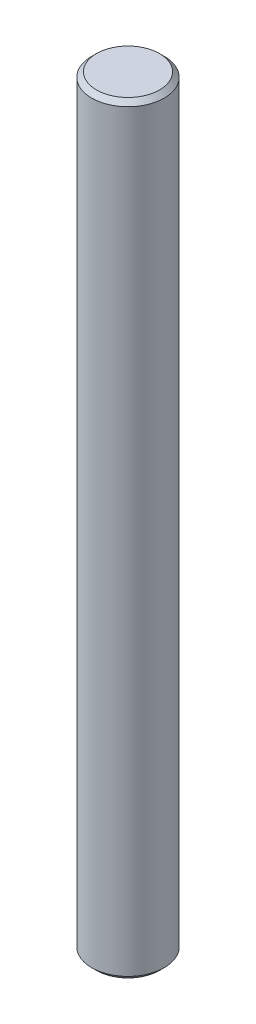
ISO-10303-21;
HEADER;
FILE_DESCRIPTION(('STEP AP214'),'2;1');
FILE_NAME('part.step','',(''),(''),'','','');
FILE_SCHEMA(('AUTOMOTIVE_DESIGN { 1 0 10303 214 1 1 1 1 }'));
ENDSEC;
DATA;
#1=APPLICATION_CONTEXT('core data for automotive mechanical design processes');
#2=APPLICATION_PROTOCOL_DEFINITION('international standard','automotive_design',2000,#1);
#3=PRODUCT_CONTEXT('',#1,'mechanical');
#4=PRODUCT('Part','Part','',(#3));
#5=PRODUCT_RELATED_PRODUCT_CATEGORY('part','',(#4));
#6=PRODUCT_DEFINITION_FORMATION('','',#4);
#7=PRODUCT_DEFINITION_CONTEXT('part definition',#1,'design');
#8=PRODUCT_DEFINITION('design','',#6,#7);
#9=PRODUCT_DEFINITION_SHAPE('','',#8);
#10=(LENGTH_UNIT() NAMED_UNIT(*) SI_UNIT(.MILLI.,.METRE.));
#11=(NAMED_UNIT(*) PLANE_ANGLE_UNIT() SI_UNIT($,.RADIAN.));
#12=(NAMED_UNIT(*) SI_UNIT($,.STERADIAN.) SOLID_ANGLE_UNIT());
#13=UNCERTAINTY_MEASURE_WITH_UNIT(LENGTH_MEASURE(1.E-05),#10,'distance_accuracy_value','');
#14=(GEOMETRIC_REPRESENTATION_CONTEXT(3) GLOBAL_UNCERTAINTY_ASSIGNED_CONTEXT((#13)) GLOBAL_UNIT_ASSIGNED_CONTEXT((#10,
#11,#12)) REPRESENTATION_CONTEXT('',''));
#15=CARTESIAN_POINT('',(0.,0.,0.));
#16=DIRECTION('',(0.,0.,1.));
#17=DIRECTION('',(1.,0.,0.));
#18=AXIS2_PLACEMENT_3D('',#15,#16,#17);
#19=CARTESIAN_POINT('',(0.,40.5,0.));
#20=DIRECTION('',(0.,-1.,0.));
#21=DIRECTION('',(0.,0.,-1.));
#22=AXIS2_PLACEMENT_3D('',#19,#20,#21);
#23=CYLINDRICAL_SURFACE('',#22,3.85);
#24=CARTESIAN_POINT('',(0.,-40.,0.));
#25=DIRECTION('',(0.,1.,0.));
#26=DIRECTION('',(0.,0.,1.));
#27=AXIS2_PLACEMENT_3D('',#24,#25,#26);
#28=CIRCLE('',#27,3.85);
#29=CARTESIAN_POINT('',(0.,-40.,3.85));
#30=VERTEX_POINT('',#29);
#31=EDGE_CURVE('E59',#30,#30,#28,.T.);
#32=ORIENTED_EDGE('',*,*,#31,.T.);
#33=EDGE_LOOP('',(#32));
#34=FACE_BOUND('',#33,.T.);
#35=CARTESIAN_POINT('',(0.,40.,0.));
#36=DIRECTION('',(0.,1.,0.));
#37=DIRECTION('',(0.,0.,1.));
#38=AXIS2_PLACEMENT_3D('',#35,#36,#37);
#39=CIRCLE('',#38,3.85);
#40=CARTESIAN_POINT('',(0.,40.,3.85));
#41=VERTEX_POINT('',#40);
#42=EDGE_CURVE('E64',#41,#41,#39,.F.);
#43=ORIENTED_EDGE('',*,*,#42,.T.);
#44=EDGE_LOOP('',(#43));
#45=FACE_BOUND('',#44,.T.);
#46=ADVANCED_FACE('F45',(#34,#45),#23,.T.);
#47=CARTESIAN_POINT('',(0.,40.5,0.));
#48=DIRECTION('',(0.,1.,0.));
#49=DIRECTION('',(0.,0.,1.));
#50=AXIS2_PLACEMENT_3D('',#47,#48,#49);
#51=PLANE('',#50);
#52=CARTESIAN_POINT('',(0.,40.5,0.));
#53=DIRECTION('',(0.,1.,0.));
#54=DIRECTION('',(0.,0.,1.));
#55=AXIS2_PLACEMENT_3D('',#52,#53,#54);
#56=CIRCLE('',#55,3.35);
#57=CARTESIAN_POINT('',(0.,40.5,3.35));
#58=VERTEX_POINT('',#57);
#59=EDGE_CURVE('E10',#58,#58,#56,.T.);
#60=ORIENTED_EDGE('',*,*,#59,.T.);
#61=EDGE_LOOP('',(#60));
#62=FACE_BOUND('',#61,.T.);
#63=ADVANCED_FACE('F81',(#62),#51,.T.);
#64=CARTESIAN_POINT('',(0.,-40.5,0.));
#65=DIRECTION('',(0.,1.,0.));
#66=DIRECTION('',(0.,0.,1.));
#67=AXIS2_PLACEMENT_3D('',#64,#65,#66);
#68=PLANE('',#67);
#69=CARTESIAN_POINT('',(0.,-40.5,0.));
#70=DIRECTION('',(0.,1.,0.));
#71=DIRECTION('',(0.,0.,1.));
#72=AXIS2_PLACEMENT_3D('',#69,#70,#71);
#73=CIRCLE('',#72,3.35000000000001);
#74=CARTESIAN_POINT('',(0.,-40.5,3.35000000000001));
#75=VERTEX_POINT('',#74);
#76=EDGE_CURVE('E54',#75,#75,#73,.F.);
#77=ORIENTED_EDGE('',*,*,#76,.T.);
#78=EDGE_LOOP('',(#77));
#79=FACE_BOUND('',#78,.T.);
#80=ADVANCED_FACE('F78',(#79),#68,.F.);
#81=CARTESIAN_POINT('',(0.,-40.,0.));
#82=DIRECTION('',(0.,1.,0.));
#83=DIRECTION('',(0.,0.,1.));
#84=AXIS2_PLACEMENT_3D('',#81,#82,#83);
#85=CONICAL_SURFACE('',#84,3.85,0.78539816339745);
#86=ORIENTED_EDGE('',*,*,#76,.F.);
#87=EDGE_LOOP('',(#86));
#88=FACE_BOUND('',#87,.T.);
#89=ORIENTED_EDGE('',*,*,#31,.F.);
#90=EDGE_LOOP('',(#89));
#91=FACE_BOUND('',#90,.T.);
#92=ADVANCED_FACE('F74',(#88,#91),#85,.T.);
#93=CARTESIAN_POINT('',(0.,40.5,0.));
#94=DIRECTION('',(0.,-1.,0.));
#95=DIRECTION('',(0.,0.,-1.));
#96=AXIS2_PLACEMENT_3D('',#93,#94,#95);
#97=CONICAL_SURFACE('',#96,3.35,0.78539816339745);
#98=ORIENTED_EDGE('',*,*,#42,.F.);
#99=EDGE_LOOP('',(#98));
#100=FACE_BOUND('',#99,.T.);
#101=ORIENTED_EDGE('',*,*,#59,.F.);
#102=EDGE_LOOP('',(#101));
#103=FACE_BOUND('',#102,.T.);
#104=ADVANCED_FACE('F48',(#100,#103),#97,.T.);
#105=CLOSED_SHELL('',(#46,#63,#80,#92,#104));
#106=MANIFOLD_SOLID_BREP('B2',#105);
#107=ADVANCED_BREP_SHAPE_REPRESENTATION('',(#18,#106),#14);
#108=SHAPE_DEFINITION_REPRESENTATION(#9,#107);
ENDSEC;
END-ISO-10303-21;
